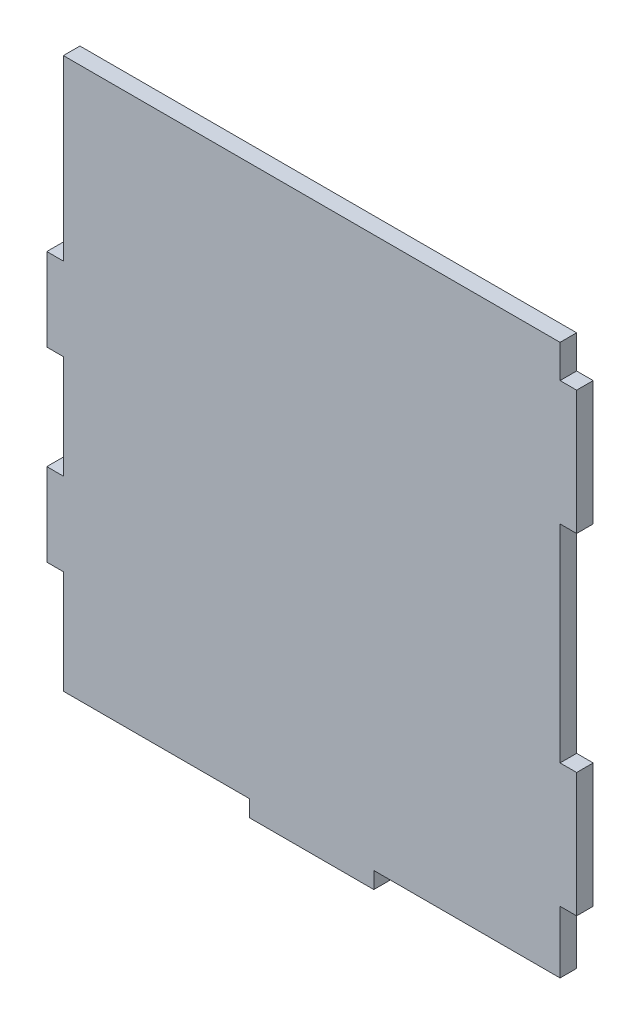
ISO-10303-21;
HEADER;
FILE_DESCRIPTION(('STEP AP214'),'2;1');
FILE_NAME('part.step','',(''),(''),'','','');
FILE_SCHEMA(('AUTOMOTIVE_DESIGN { 1 0 10303 214 1 1 1 1 }'));
ENDSEC;
DATA;
#1=APPLICATION_CONTEXT('core data for automotive mechanical design processes');
#2=APPLICATION_PROTOCOL_DEFINITION('international standard','automotive_design',2000,#1);
#3=PRODUCT_CONTEXT('',#1,'mechanical');
#4=PRODUCT('Part','Part','',(#3));
#5=PRODUCT_RELATED_PRODUCT_CATEGORY('part','',(#4));
#6=PRODUCT_DEFINITION_FORMATION('','',#4);
#7=PRODUCT_DEFINITION_CONTEXT('part definition',#1,'design');
#8=PRODUCT_DEFINITION('design','',#6,#7);
#9=PRODUCT_DEFINITION_SHAPE('','',#8);
#10=(LENGTH_UNIT() NAMED_UNIT(*) SI_UNIT(.MILLI.,.METRE.));
#11=(NAMED_UNIT(*) PLANE_ANGLE_UNIT() SI_UNIT($,.RADIAN.));
#12=(NAMED_UNIT(*) SI_UNIT($,.STERADIAN.) SOLID_ANGLE_UNIT());
#13=UNCERTAINTY_MEASURE_WITH_UNIT(LENGTH_MEASURE(1.E-05),#10,'distance_accuracy_value','');
#14=(GEOMETRIC_REPRESENTATION_CONTEXT(3) GLOBAL_UNCERTAINTY_ASSIGNED_CONTEXT((#13)) GLOBAL_UNIT_ASSIGNED_CONTEXT((#10,
#11,#12)) REPRESENTATION_CONTEXT('',''));
#15=CARTESIAN_POINT('',(0.,0.,0.));
#16=DIRECTION('',(0.,0.,1.));
#17=DIRECTION('',(1.,0.,0.));
#18=AXIS2_PLACEMENT_3D('',#15,#16,#17);
#19=CARTESIAN_POINT('',(0.,0.,4.));
#20=DIRECTION('',(0.,1.,0.));
#21=DIRECTION('',(0.,0.,1.));
#22=AXIS2_PLACEMENT_3D('',#19,#20,#21);
#23=PLANE('',#22);
#24=DIRECTION('',(1.,0.,0.));
#25=VECTOR('',#24,1.);
#26=CARTESIAN_POINT('',(0.,0.,0.));
#27=LINE('',#26,#25);
#28=CARTESIAN_POINT('',(0.,0.,0.));
#29=VERTEX_POINT('',#28);
#30=CARTESIAN_POINT('',(45.,0.,0.));
#31=VERTEX_POINT('',#30);
#32=EDGE_CURVE('E233',#29,#31,#27,.T.);
#33=ORIENTED_EDGE('',*,*,#32,.T.);
#34=DIRECTION('',(0.,0.,-1.));
#35=VECTOR('',#34,1.);
#36=CARTESIAN_POINT('',(45.,0.,4.));
#37=LINE('',#36,#35);
#38=CARTESIAN_POINT('',(45.,0.,4.));
#39=VERTEX_POINT('',#38);
#40=EDGE_CURVE('E11',#39,#31,#37,.T.);
#41=ORIENTED_EDGE('',*,*,#40,.F.);
#42=DIRECTION('',(1.,0.,0.));
#43=VECTOR('',#42,1.);
#44=CARTESIAN_POINT('',(0.,0.,4.));
#45=LINE('',#44,#43);
#46=CARTESIAN_POINT('',(0.,0.,4.));
#47=VERTEX_POINT('',#46);
#48=EDGE_CURVE('E352',#47,#39,#45,.T.);
#49=ORIENTED_EDGE('',*,*,#48,.F.);
#50=DIRECTION('',(0.,0.,-1.));
#51=VECTOR('',#50,1.);
#52=CARTESIAN_POINT('',(0.,0.,4.));
#53=LINE('',#52,#51);
#54=EDGE_CURVE('E54',#47,#29,#53,.T.);
#55=ORIENTED_EDGE('',*,*,#54,.T.);
#56=EDGE_LOOP('',(#33,#41,#49,#55));
#57=FACE_BOUND('',#56,.T.);
#58=ADVANCED_FACE('F37',(#57),#23,.F.);
#59=CARTESIAN_POINT('',(45.,0.,4.));
#60=DIRECTION('',(1.,0.,0.));
#61=DIRECTION('',(0.,0.,-1.));
#62=AXIS2_PLACEMENT_3D('',#59,#60,#61);
#63=PLANE('',#62);
#64=DIRECTION('',(0.,-1.,0.));
#65=VECTOR('',#64,1.);
#66=CARTESIAN_POINT('',(45.,0.,0.));
#67=LINE('',#66,#65);
#68=CARTESIAN_POINT('',(45.,-4.,0.));
#69=VERTEX_POINT('',#68);
#70=EDGE_CURVE('E235',#31,#69,#67,.T.);
#71=ORIENTED_EDGE('',*,*,#70,.T.);
#72=DIRECTION('',(0.,0.,-1.));
#73=VECTOR('',#72,1.);
#74=CARTESIAN_POINT('',(45.,-4.,4.));
#75=LINE('',#74,#73);
#76=CARTESIAN_POINT('',(45.,-4.,4.));
#77=VERTEX_POINT('',#76);
#78=EDGE_CURVE('E46',#77,#69,#75,.T.);
#79=ORIENTED_EDGE('',*,*,#78,.F.);
#80=DIRECTION('',(0.,-1.,0.));
#81=VECTOR('',#80,1.);
#82=CARTESIAN_POINT('',(45.,0.,4.));
#83=LINE('',#82,#81);
#84=EDGE_CURVE('E140',#39,#77,#83,.T.);
#85=ORIENTED_EDGE('',*,*,#84,.F.);
#86=ORIENTED_EDGE('',*,*,#40,.T.);
#87=EDGE_LOOP('',(#71,#79,#85,#86));
#88=FACE_BOUND('',#87,.T.);
#89=ADVANCED_FACE('F39',(#88),#63,.F.);
#90=CARTESIAN_POINT('',(0.,-4.00000000000001,4.));
#91=DIRECTION('',(0.,1.,0.));
#92=DIRECTION('',(-1.,0.,0.));
#93=AXIS2_PLACEMENT_3D('',#90,#91,#92);
#94=PLANE('',#93);
#95=DIRECTION('',(1.,0.,0.));
#96=VECTOR('',#95,1.);
#97=CARTESIAN_POINT('',(0.,-4.00000000000001,0.));
#98=LINE('',#97,#96);
#99=CARTESIAN_POINT('',(75.,-4.,0.));
#100=VERTEX_POINT('',#99);
#101=EDGE_CURVE('E238',#69,#100,#98,.T.);
#102=ORIENTED_EDGE('',*,*,#101,.T.);
#103=DIRECTION('',(0.,0.,-1.));
#104=VECTOR('',#103,1.);
#105=CARTESIAN_POINT('',(75.,-4.,4.));
#106=LINE('',#105,#104);
#107=CARTESIAN_POINT('',(75.,-4.,4.));
#108=VERTEX_POINT('',#107);
#109=EDGE_CURVE('E329',#108,#100,#106,.T.);
#110=ORIENTED_EDGE('',*,*,#109,.F.);
#111=DIRECTION('',(1.,0.,0.));
#112=VECTOR('',#111,1.);
#113=CARTESIAN_POINT('',(0.,-4.00000000000001,4.));
#114=LINE('',#113,#112);
#115=EDGE_CURVE('E336',#77,#108,#114,.T.);
#116=ORIENTED_EDGE('',*,*,#115,.F.);
#117=ORIENTED_EDGE('',*,*,#78,.T.);
#118=EDGE_LOOP('',(#102,#110,#116,#117));
#119=FACE_BOUND('',#118,.T.);
#120=ADVANCED_FACE('F334',(#119),#94,.F.);
#121=CARTESIAN_POINT('',(75.,0.,4.));
#122=DIRECTION('',(1.,0.,0.));
#123=DIRECTION('',(0.,0.,-1.));
#124=AXIS2_PLACEMENT_3D('',#121,#122,#123);
#125=PLANE('',#124);
#126=DIRECTION('',(0.,-1.,0.));
#127=VECTOR('',#126,1.);
#128=CARTESIAN_POINT('',(75.,0.,0.));
#129=LINE('',#128,#127);
#130=CARTESIAN_POINT('',(75.,0.,0.));
#131=VERTEX_POINT('',#130);
#132=EDGE_CURVE('E241',#131,#100,#129,.T.);
#133=ORIENTED_EDGE('',*,*,#132,.F.);
#134=DIRECTION('',(0.,0.,-1.));
#135=VECTOR('',#134,1.);
#136=CARTESIAN_POINT('',(75.,0.,4.));
#137=LINE('',#136,#135);
#138=CARTESIAN_POINT('',(75.,0.,4.));
#139=VERTEX_POINT('',#138);
#140=EDGE_CURVE('E327',#139,#131,#137,.T.);
#141=ORIENTED_EDGE('',*,*,#140,.F.);
#142=DIRECTION('',(0.,-1.,0.));
#143=VECTOR('',#142,1.);
#144=CARTESIAN_POINT('',(75.,0.,4.));
#145=LINE('',#144,#143);
#146=EDGE_CURVE('E347',#139,#108,#145,.T.);
#147=ORIENTED_EDGE('',*,*,#146,.T.);
#148=ORIENTED_EDGE('',*,*,#109,.T.);
#149=EDGE_LOOP('',(#133,#141,#147,#148));
#150=FACE_BOUND('',#149,.T.);
#151=ADVANCED_FACE('F343',(#150),#125,.T.);
#152=CARTESIAN_POINT('',(120.,0.,0.));
#153=VERTEX_POINT('',#152);
#154=EDGE_CURVE('E236',#131,#153,#27,.T.);
#155=ORIENTED_EDGE('',*,*,#154,.T.);
#156=DIRECTION('',(0.,0.,-1.));
#157=VECTOR('',#156,1.);
#158=CARTESIAN_POINT('',(120.,0.,4.));
#159=LINE('',#158,#157);
#160=CARTESIAN_POINT('',(120.,0.,4.));
#161=VERTEX_POINT('',#160);
#162=EDGE_CURVE('E324',#161,#153,#159,.T.);
#163=ORIENTED_EDGE('',*,*,#162,.F.);
#164=EDGE_CURVE('E348',#139,#161,#45,.T.);
#165=ORIENTED_EDGE('',*,*,#164,.F.);
#166=ORIENTED_EDGE('',*,*,#140,.T.);
#167=EDGE_LOOP('',(#155,#163,#165,#166));
#168=FACE_BOUND('',#167,.T.);
#169=ADVANCED_FACE('F406',(#168),#23,.F.);
#170=CARTESIAN_POINT('',(120.,0.,4.));
#171=DIRECTION('',(-1.,0.,0.));
#172=DIRECTION('',(0.,0.,1.));
#173=AXIS2_PLACEMENT_3D('',#170,#171,#172);
#174=PLANE('',#173);
#175=DIRECTION('',(0.,1.,0.));
#176=VECTOR('',#175,1.);
#177=CARTESIAN_POINT('',(120.,0.,0.));
#178=LINE('',#177,#176);
#179=CARTESIAN_POINT('',(120.,15.,0.));
#180=VERTEX_POINT('',#179);
#181=EDGE_CURVE('E244',#153,#180,#178,.T.);
#182=ORIENTED_EDGE('',*,*,#181,.T.);
#183=DIRECTION('',(0.,0.,-1.));
#184=VECTOR('',#183,1.);
#185=CARTESIAN_POINT('',(120.,15.,4.));
#186=LINE('',#185,#184);
#187=CARTESIAN_POINT('',(120.,15.,4.));
#188=VERTEX_POINT('',#187);
#189=EDGE_CURVE('E321',#188,#180,#186,.T.);
#190=ORIENTED_EDGE('',*,*,#189,.F.);
#191=DIRECTION('',(0.,1.,0.));
#192=VECTOR('',#191,1.);
#193=CARTESIAN_POINT('',(120.,0.,4.));
#194=LINE('',#193,#192);
#195=EDGE_CURVE('E350',#161,#188,#194,.T.);
#196=ORIENTED_EDGE('',*,*,#195,.F.);
#197=ORIENTED_EDGE('',*,*,#162,.T.);
#198=EDGE_LOOP('',(#182,#190,#196,#197));
#199=FACE_BOUND('',#198,.T.);
#200=ADVANCED_FACE('F412',(#199),#174,.F.);
#201=CARTESIAN_POINT('',(0.,15.0000000000004,4.));
#202=DIRECTION('',(0.,1.,0.));
#203=DIRECTION('',(-1.,0.,0.));
#204=AXIS2_PLACEMENT_3D('',#201,#202,#203);
#205=PLANE('',#204);
#206=DIRECTION('',(1.,0.,0.));
#207=VECTOR('',#206,1.);
#208=CARTESIAN_POINT('',(0.,15.0000000000004,0.));
#209=LINE('',#208,#207);
#210=CARTESIAN_POINT('',(124.,15.,0.));
#211=VERTEX_POINT('',#210);
#212=EDGE_CURVE('E246',#180,#211,#209,.T.);
#213=ORIENTED_EDGE('',*,*,#212,.T.);
#214=DIRECTION('',(0.,0.,-1.));
#215=VECTOR('',#214,1.);
#216=CARTESIAN_POINT('',(124.,15.,4.));
#217=LINE('',#216,#215);
#218=CARTESIAN_POINT('',(124.,15.,4.));
#219=VERTEX_POINT('',#218);
#220=EDGE_CURVE('E319',#219,#211,#217,.T.);
#221=ORIENTED_EDGE('',*,*,#220,.F.);
#222=DIRECTION('',(1.,0.,0.));
#223=VECTOR('',#222,1.);
#224=CARTESIAN_POINT('',(0.,15.0000000000004,4.));
#225=LINE('',#224,#223);
#226=EDGE_CURVE('E357',#188,#219,#225,.T.);
#227=ORIENTED_EDGE('',*,*,#226,.F.);
#228=ORIENTED_EDGE('',*,*,#189,.T.);
#229=EDGE_LOOP('',(#213,#221,#227,#228));
#230=FACE_BOUND('',#229,.T.);
#231=ADVANCED_FACE('F418',(#230),#205,.F.);
#232=CARTESIAN_POINT('',(124.,0.,4.));
#233=DIRECTION('',(1.,0.,0.));
#234=DIRECTION('',(0.,1.,0.));
#235=AXIS2_PLACEMENT_3D('',#232,#233,#234);
#236=PLANE('',#235);
#237=DIRECTION('',(0.,-1.,0.));
#238=VECTOR('',#237,1.);
#239=CARTESIAN_POINT('',(124.,0.,0.));
#240=LINE('',#239,#238);
#241=CARTESIAN_POINT('',(124.,45.,0.));
#242=VERTEX_POINT('',#241);
#243=EDGE_CURVE('E251',#242,#211,#240,.T.);
#244=ORIENTED_EDGE('',*,*,#243,.F.);
#245=DIRECTION('',(0.,0.,-1.));
#246=VECTOR('',#245,1.);
#247=CARTESIAN_POINT('',(124.,45.,4.));
#248=LINE('',#247,#246);
#249=CARTESIAN_POINT('',(124.,45.,4.));
#250=VERTEX_POINT('',#249);
#251=EDGE_CURVE('E317',#250,#242,#248,.T.);
#252=ORIENTED_EDGE('',*,*,#251,.F.);
#253=DIRECTION('',(0.,-1.,0.));
#254=VECTOR('',#253,1.);
#255=CARTESIAN_POINT('',(124.,0.,4.));
#256=LINE('',#255,#254);
#257=EDGE_CURVE('E361',#250,#219,#256,.T.);
#258=ORIENTED_EDGE('',*,*,#257,.T.);
#259=ORIENTED_EDGE('',*,*,#220,.T.);
#260=EDGE_LOOP('',(#244,#252,#258,#259));
#261=FACE_BOUND('',#260,.T.);
#262=ADVANCED_FACE('F485',(#261),#236,.T.);
#263=CARTESIAN_POINT('',(0.,45.,4.));
#264=DIRECTION('',(0.,1.,0.));
#265=DIRECTION('',(0.,0.,1.));
#266=AXIS2_PLACEMENT_3D('',#263,#264,#265);
#267=PLANE('',#266);
#268=DIRECTION('',(1.,0.,0.));
#269=VECTOR('',#268,1.);
#270=CARTESIAN_POINT('',(0.,45.,0.));
#271=LINE('',#270,#269);
#272=CARTESIAN_POINT('',(120.,45.,0.));
#273=VERTEX_POINT('',#272);
#274=EDGE_CURVE('E254',#273,#242,#271,.T.);
#275=ORIENTED_EDGE('',*,*,#274,.F.);
#276=DIRECTION('',(0.,0.,-1.));
#277=VECTOR('',#276,1.);
#278=CARTESIAN_POINT('',(120.,45.,4.));
#279=LINE('',#278,#277);
#280=CARTESIAN_POINT('',(120.,45.,4.));
#281=VERTEX_POINT('',#280);
#282=EDGE_CURVE('E315',#281,#273,#279,.T.);
#283=ORIENTED_EDGE('',*,*,#282,.F.);
#284=DIRECTION('',(1.,0.,0.));
#285=VECTOR('',#284,1.);
#286=CARTESIAN_POINT('',(0.,45.,4.));
#287=LINE('',#286,#285);
#288=EDGE_CURVE('E364',#281,#250,#287,.T.);
#289=ORIENTED_EDGE('',*,*,#288,.T.);
#290=ORIENTED_EDGE('',*,*,#251,.T.);
#291=EDGE_LOOP('',(#275,#283,#289,#290));
#292=FACE_BOUND('',#291,.T.);
#293=ADVANCED_FACE('F436',(#292),#267,.T.);
#294=CARTESIAN_POINT('',(120.,95.,0.));
#295=VERTEX_POINT('',#294);
#296=EDGE_CURVE('E248',#273,#295,#178,.T.);
#297=ORIENTED_EDGE('',*,*,#296,.T.);
#298=DIRECTION('',(0.,0.,-1.));
#299=VECTOR('',#298,1.);
#300=CARTESIAN_POINT('',(120.,95.,4.));
#301=LINE('',#300,#299);
#302=CARTESIAN_POINT('',(120.,95.,4.));
#303=VERTEX_POINT('',#302);
#304=EDGE_CURVE('E312',#303,#295,#301,.T.);
#305=ORIENTED_EDGE('',*,*,#304,.F.);
#306=EDGE_CURVE('E359',#281,#303,#194,.T.);
#307=ORIENTED_EDGE('',*,*,#306,.F.);
#308=ORIENTED_EDGE('',*,*,#282,.T.);
#309=EDGE_LOOP('',(#297,#305,#307,#308));
#310=FACE_BOUND('',#309,.T.);
#311=ADVANCED_FACE('F421',(#310),#174,.F.);
#312=CARTESIAN_POINT('',(0.,95.,4.));
#313=DIRECTION('',(0.,1.,0.));
#314=DIRECTION('',(0.,0.,1.));
#315=AXIS2_PLACEMENT_3D('',#312,#313,#314);
#316=PLANE('',#315);
#317=DIRECTION('',(1.,0.,0.));
#318=VECTOR('',#317,1.);
#319=CARTESIAN_POINT('',(0.,95.,0.));
#320=LINE('',#319,#318);
#321=CARTESIAN_POINT('',(124.,95.,0.));
#322=VERTEX_POINT('',#321);
#323=EDGE_CURVE('E257',#295,#322,#320,.T.);
#324=ORIENTED_EDGE('',*,*,#323,.T.);
#325=DIRECTION('',(0.,0.,-1.));
#326=VECTOR('',#325,1.);
#327=CARTESIAN_POINT('',(124.,95.,4.));
#328=LINE('',#327,#326);
#329=CARTESIAN_POINT('',(124.,95.,4.));
#330=VERTEX_POINT('',#329);
#331=EDGE_CURVE('E310',#330,#322,#328,.T.);
#332=ORIENTED_EDGE('',*,*,#331,.F.);
#333=DIRECTION('',(1.,0.,0.));
#334=VECTOR('',#333,1.);
#335=CARTESIAN_POINT('',(0.,95.,4.));
#336=LINE('',#335,#334);
#337=EDGE_CURVE('E367',#303,#330,#336,.T.);
#338=ORIENTED_EDGE('',*,*,#337,.F.);
#339=ORIENTED_EDGE('',*,*,#304,.T.);
#340=EDGE_LOOP('',(#324,#332,#338,#339));
#341=FACE_BOUND('',#340,.T.);
#342=ADVANCED_FACE('F473',(#341),#316,.F.);
#343=CARTESIAN_POINT('',(124.,0.,4.));
#344=DIRECTION('',(1.,0.,0.));
#345=DIRECTION('',(0.,0.,-1.));
#346=AXIS2_PLACEMENT_3D('',#343,#344,#345);
#347=PLANE('',#346);
#348=DIRECTION('',(0.,-1.,0.));
#349=VECTOR('',#348,1.);
#350=CARTESIAN_POINT('',(124.,0.,0.));
#351=LINE('',#350,#349);
#352=CARTESIAN_POINT('',(124.,125.,0.));
#353=VERTEX_POINT('',#352);
#354=EDGE_CURVE('E260',#353,#322,#351,.T.);
#355=ORIENTED_EDGE('',*,*,#354,.F.);
#356=DIRECTION('',(0.,0.,-1.));
#357=VECTOR('',#356,1.);
#358=CARTESIAN_POINT('',(124.,125.,4.));
#359=LINE('',#358,#357);
#360=CARTESIAN_POINT('',(124.,125.,4.));
#361=VERTEX_POINT('',#360);
#362=EDGE_CURVE('E308',#361,#353,#359,.T.);
#363=ORIENTED_EDGE('',*,*,#362,.F.);
#364=DIRECTION('',(0.,-1.,0.));
#365=VECTOR('',#364,1.);
#366=CARTESIAN_POINT('',(124.,0.,4.));
#367=LINE('',#366,#365);
#368=EDGE_CURVE('E369',#361,#330,#367,.T.);
#369=ORIENTED_EDGE('',*,*,#368,.T.);
#370=ORIENTED_EDGE('',*,*,#331,.T.);
#371=EDGE_LOOP('',(#355,#363,#369,#370));
#372=FACE_BOUND('',#371,.T.);
#373=ADVANCED_FACE('F469',(#372),#347,.T.);
#374=CARTESIAN_POINT('',(0.,125.,4.));
#375=DIRECTION('',(0.,1.,0.));
#376=DIRECTION('',(0.,0.,1.));
#377=AXIS2_PLACEMENT_3D('',#374,#375,#376);
#378=PLANE('',#377);
#379=DIRECTION('',(1.,0.,0.));
#380=VECTOR('',#379,1.);
#381=CARTESIAN_POINT('',(0.,125.,0.));
#382=LINE('',#381,#380);
#383=CARTESIAN_POINT('',(120.,125.,0.));
#384=VERTEX_POINT('',#383);
#385=EDGE_CURVE('E263',#384,#353,#382,.T.);
#386=ORIENTED_EDGE('',*,*,#385,.F.);
#387=DIRECTION('',(0.,0.,-1.));
#388=VECTOR('',#387,1.);
#389=CARTESIAN_POINT('',(120.,125.,4.));
#390=LINE('',#389,#388);
#391=CARTESIAN_POINT('',(120.,125.,4.));
#392=VERTEX_POINT('',#391);
#393=EDGE_CURVE('E306',#392,#384,#390,.T.);
#394=ORIENTED_EDGE('',*,*,#393,.F.);
#395=DIRECTION('',(1.,0.,0.));
#396=VECTOR('',#395,1.);
#397=CARTESIAN_POINT('',(0.,125.,4.));
#398=LINE('',#397,#396);
#399=EDGE_CURVE('E372',#392,#361,#398,.T.);
#400=ORIENTED_EDGE('',*,*,#399,.T.);
#401=ORIENTED_EDGE('',*,*,#362,.T.);
#402=EDGE_LOOP('',(#386,#394,#400,#401));
#403=FACE_BOUND('',#402,.T.);
#404=ADVANCED_FACE('F466',(#403),#378,.T.);
#405=CARTESIAN_POINT('',(120.,133.,0.));
#406=VERTEX_POINT('',#405);
#407=EDGE_CURVE('E247',#384,#406,#178,.T.);
#408=ORIENTED_EDGE('',*,*,#407,.T.);
#409=DIRECTION('',(0.,0.,-1.));
#410=VECTOR('',#409,1.);
#411=CARTESIAN_POINT('',(120.,133.,4.));
#412=LINE('',#411,#410);
#413=CARTESIAN_POINT('',(120.,133.,4.));
#414=VERTEX_POINT('',#413);
#415=EDGE_CURVE('E304',#414,#406,#412,.T.);
#416=ORIENTED_EDGE('',*,*,#415,.F.);
#417=EDGE_CURVE('E358',#392,#414,#194,.T.);
#418=ORIENTED_EDGE('',*,*,#417,.F.);
#419=ORIENTED_EDGE('',*,*,#393,.T.);
#420=EDGE_LOOP('',(#408,#416,#418,#419));
#421=FACE_BOUND('',#420,.T.);
#422=ADVANCED_FACE('F422',(#421),#174,.F.);
#423=CARTESIAN_POINT('',(0.,133.,4.));
#424=DIRECTION('',(0.,1.,0.));
#425=DIRECTION('',(0.,0.,1.));
#426=AXIS2_PLACEMENT_3D('',#423,#424,#425);
#427=PLANE('',#426);
#428=DIRECTION('',(1.,0.,0.));
#429=VECTOR('',#428,1.);
#430=CARTESIAN_POINT('',(0.,133.,0.));
#431=LINE('',#430,#429);
#432=CARTESIAN_POINT('',(0.,133.,0.));
#433=VERTEX_POINT('',#432);
#434=EDGE_CURVE('E266',#433,#406,#431,.T.);
#435=ORIENTED_EDGE('',*,*,#434,.F.);
#436=DIRECTION('',(0.,0.,-1.));
#437=VECTOR('',#436,1.);
#438=CARTESIAN_POINT('',(0.,133.,4.));
#439=LINE('',#438,#437);
#440=CARTESIAN_POINT('',(0.,133.,4.));
#441=VERTEX_POINT('',#440);
#442=EDGE_CURVE('E302',#441,#433,#439,.T.);
#443=ORIENTED_EDGE('',*,*,#442,.F.);
#444=DIRECTION('',(1.,0.,0.));
#445=VECTOR('',#444,1.);
#446=CARTESIAN_POINT('',(0.,133.,4.));
#447=LINE('',#446,#445);
#448=EDGE_CURVE('E375',#441,#414,#447,.T.);
#449=ORIENTED_EDGE('',*,*,#448,.T.);
#450=ORIENTED_EDGE('',*,*,#415,.T.);
#451=EDGE_LOOP('',(#435,#443,#449,#450));
#452=FACE_BOUND('',#451,.T.);
#453=ADVANCED_FACE('F453',(#452),#427,.T.);
#454=CARTESIAN_POINT('',(0.,0.,4.));
#455=DIRECTION('',(-1.,0.,0.));
#456=DIRECTION('',(0.,0.,1.));
#457=AXIS2_PLACEMENT_3D('',#454,#455,#456);
#458=PLANE('',#457);
#459=DIRECTION('',(0.,1.,0.));
#460=VECTOR('',#459,1.);
#461=CARTESIAN_POINT('',(0.,0.,0.));
#462=LINE('',#461,#460);
#463=CARTESIAN_POINT('',(0.,90.,0.));
#464=VERTEX_POINT('',#463);
#465=EDGE_CURVE('E269',#464,#433,#462,.T.);
#466=ORIENTED_EDGE('',*,*,#465,.F.);
#467=DIRECTION('',(0.,0.,-1.));
#468=VECTOR('',#467,1.);
#469=CARTESIAN_POINT('',(0.,90.,4.));
#470=LINE('',#469,#468);
#471=CARTESIAN_POINT('',(0.,90.,4.));
#472=VERTEX_POINT('',#471);
#473=EDGE_CURVE('E300',#472,#464,#470,.T.);
#474=ORIENTED_EDGE('',*,*,#473,.F.);
#475=DIRECTION('',(0.,1.,0.));
#476=VECTOR('',#475,1.);
#477=CARTESIAN_POINT('',(0.,0.,4.));
#478=LINE('',#477,#476);
#479=EDGE_CURVE('E230',#472,#441,#478,.T.);
#480=ORIENTED_EDGE('',*,*,#479,.T.);
#481=ORIENTED_EDGE('',*,*,#442,.T.);
#482=EDGE_LOOP('',(#466,#474,#480,#481));
#483=FACE_BOUND('',#482,.T.);
#484=ADVANCED_FACE('F456',(#483),#458,.T.);
#485=CARTESIAN_POINT('',(6.24500451351651E-13,90.,4.));
#486=DIRECTION('',(0.,-1.,0.));
#487=DIRECTION('',(1.,0.,0.));
#488=AXIS2_PLACEMENT_3D('',#485,#486,#487);
#489=PLANE('',#488);
#490=DIRECTION('',(-1.,0.,0.));
#491=VECTOR('',#490,1.);
#492=CARTESIAN_POINT('',(6.24500451351651E-13,90.,0.));
#493=LINE('',#492,#491);
#494=CARTESIAN_POINT('',(-4.,90.,0.));
#495=VERTEX_POINT('',#494);
#496=EDGE_CURVE('E272',#464,#495,#493,.T.);
#497=ORIENTED_EDGE('',*,*,#496,.T.);
#498=DIRECTION('',(0.,0.,-1.));
#499=VECTOR('',#498,1.);
#500=CARTESIAN_POINT('',(-4.,90.,4.));
#501=LINE('',#500,#499);
#502=CARTESIAN_POINT('',(-4.,90.,4.));
#503=VERTEX_POINT('',#502);
#504=EDGE_CURVE('E297',#503,#495,#501,.T.);
#505=ORIENTED_EDGE('',*,*,#504,.F.);
#506=DIRECTION('',(-1.,0.,0.));
#507=VECTOR('',#506,1.);
#508=CARTESIAN_POINT('',(6.24500451351651E-13,90.,4.));
#509=LINE('',#508,#507);
#510=EDGE_CURVE('E379',#472,#503,#509,.T.);
#511=ORIENTED_EDGE('',*,*,#510,.F.);
#512=ORIENTED_EDGE('',*,*,#473,.T.);
#513=EDGE_LOOP('',(#497,#505,#511,#512));
#514=FACE_BOUND('',#513,.T.);
#515=ADVANCED_FACE('F460',(#514),#489,.F.);
#516=CARTESIAN_POINT('',(-4.,0.,4.));
#517=DIRECTION('',(1.,0.,0.));
#518=DIRECTION('',(0.,0.,-1.));
#519=AXIS2_PLACEMENT_3D('',#516,#517,#518);
#520=PLANE('',#519);
#521=DIRECTION('',(0.,-1.,0.));
#522=VECTOR('',#521,1.);
#523=CARTESIAN_POINT('',(-4.,0.,0.));
#524=LINE('',#523,#522);
#525=CARTESIAN_POINT('',(-4.,70.,0.));
#526=VERTEX_POINT('',#525);
#527=EDGE_CURVE('E276',#495,#526,#524,.T.);
#528=ORIENTED_EDGE('',*,*,#527,.T.);
#529=DIRECTION('',(0.,0.,-1.));
#530=VECTOR('',#529,1.);
#531=CARTESIAN_POINT('',(-4.,70.,4.));
#532=LINE('',#531,#530);
#533=CARTESIAN_POINT('',(-4.,70.,4.));
#534=VERTEX_POINT('',#533);
#535=EDGE_CURVE('E295',#534,#526,#532,.T.);
#536=ORIENTED_EDGE('',*,*,#535,.F.);
#537=DIRECTION('',(0.,-1.,0.));
#538=VECTOR('',#537,1.);
#539=CARTESIAN_POINT('',(-4.,0.,4.));
#540=LINE('',#539,#538);
#541=EDGE_CURVE('E381',#503,#534,#540,.T.);
#542=ORIENTED_EDGE('',*,*,#541,.F.);
#543=ORIENTED_EDGE('',*,*,#504,.T.);
#544=EDGE_LOOP('',(#528,#536,#542,#543));
#545=FACE_BOUND('',#544,.T.);
#546=ADVANCED_FACE('F463',(#545),#520,.F.);
#547=CARTESIAN_POINT('',(0.,70.,4.));
#548=DIRECTION('',(0.,-1.,0.));
#549=DIRECTION('',(0.,0.,-1.));
#550=AXIS2_PLACEMENT_3D('',#547,#548,#549);
#551=PLANE('',#550);
#552=DIRECTION('',(-1.,0.,0.));
#553=VECTOR('',#552,1.);
#554=CARTESIAN_POINT('',(0.,70.,0.));
#555=LINE('',#554,#553);
#556=CARTESIAN_POINT('',(0.,70.,0.));
#557=VERTEX_POINT('',#556);
#558=EDGE_CURVE('E279',#557,#526,#555,.T.);
#559=ORIENTED_EDGE('',*,*,#558,.F.);
#560=DIRECTION('',(0.,0.,-1.));
#561=VECTOR('',#560,1.);
#562=CARTESIAN_POINT('',(0.,70.,4.));
#563=LINE('',#562,#561);
#564=CARTESIAN_POINT('',(0.,70.,4.));
#565=VERTEX_POINT('',#564);
#566=EDGE_CURVE('E293',#565,#557,#563,.T.);
#567=ORIENTED_EDGE('',*,*,#566,.F.);
#568=DIRECTION('',(-1.,0.,0.));
#569=VECTOR('',#568,1.);
#570=CARTESIAN_POINT('',(0.,70.,4.));
#571=LINE('',#570,#569);
#572=EDGE_CURVE('E383',#565,#534,#571,.T.);
#573=ORIENTED_EDGE('',*,*,#572,.T.);
#574=ORIENTED_EDGE('',*,*,#535,.T.);
#575=EDGE_LOOP('',(#559,#567,#573,#574));
#576=FACE_BOUND('',#575,.T.);
#577=ADVANCED_FACE('F394',(#576),#551,.T.);
#578=CARTESIAN_POINT('',(0.,45.,0.));
#579=VERTEX_POINT('',#578);
#580=EDGE_CURVE('E274',#579,#557,#462,.T.);
#581=ORIENTED_EDGE('',*,*,#580,.F.);
#582=DIRECTION('',(0.,0.,-1.));
#583=VECTOR('',#582,1.);
#584=CARTESIAN_POINT('',(0.,45.,4.));
#585=LINE('',#584,#583);
#586=CARTESIAN_POINT('',(0.,45.,4.));
#587=VERTEX_POINT('',#586);
#588=EDGE_CURVE('E291',#587,#579,#585,.T.);
#589=ORIENTED_EDGE('',*,*,#588,.F.);
#590=EDGE_CURVE('E229',#587,#565,#478,.T.);
#591=ORIENTED_EDGE('',*,*,#590,.T.);
#592=ORIENTED_EDGE('',*,*,#566,.T.);
#593=EDGE_LOOP('',(#581,#589,#591,#592));
#594=FACE_BOUND('',#593,.T.);
#595=ADVANCED_FACE('F388',(#594),#458,.T.);
#596=CARTESIAN_POINT('',(0.,45.,4.));
#597=DIRECTION('',(0.,-1.,0.));
#598=DIRECTION('',(1.,0.,0.));
#599=AXIS2_PLACEMENT_3D('',#596,#597,#598);
#600=PLANE('',#599);
#601=DIRECTION('',(-1.,0.,0.));
#602=VECTOR('',#601,1.);
#603=CARTESIAN_POINT('',(0.,45.,0.));
#604=LINE('',#603,#602);
#605=CARTESIAN_POINT('',(-4.,45.,0.));
#606=VERTEX_POINT('',#605);
#607=EDGE_CURVE('E282',#579,#606,#604,.T.);
#608=ORIENTED_EDGE('',*,*,#607,.T.);
#609=DIRECTION('',(0.,0.,-1.));
#610=VECTOR('',#609,1.);
#611=CARTESIAN_POINT('',(-4.,45.,4.));
#612=LINE('',#611,#610);
#613=CARTESIAN_POINT('',(-4.,45.,4.));
#614=VERTEX_POINT('',#613);
#615=EDGE_CURVE('E213',#614,#606,#612,.T.);
#616=ORIENTED_EDGE('',*,*,#615,.F.);
#617=DIRECTION('',(-1.,0.,0.));
#618=VECTOR('',#617,1.);
#619=CARTESIAN_POINT('',(0.,45.,4.));
#620=LINE('',#619,#618);
#621=EDGE_CURVE('E222',#587,#614,#620,.T.);
#622=ORIENTED_EDGE('',*,*,#621,.F.);
#623=ORIENTED_EDGE('',*,*,#588,.T.);
#624=EDGE_LOOP('',(#608,#616,#622,#623));
#625=FACE_BOUND('',#624,.T.);
#626=ADVANCED_FACE('F584',(#625),#600,.F.);
#627=CARTESIAN_POINT('',(-4.,0.,4.));
#628=DIRECTION('',(-1.,0.,0.));
#629=DIRECTION('',(0.,0.,1.));
#630=AXIS2_PLACEMENT_3D('',#627,#628,#629);
#631=PLANE('',#630);
#632=DIRECTION('',(0.,1.,0.));
#633=VECTOR('',#632,1.);
#634=CARTESIAN_POINT('',(-4.,0.,0.));
#635=LINE('',#634,#633);
#636=CARTESIAN_POINT('',(-4.,25.,0.));
#637=VERTEX_POINT('',#636);
#638=EDGE_CURVE('E209',#637,#606,#635,.T.);
#639=ORIENTED_EDGE('',*,*,#638,.F.);
#640=DIRECTION('',(0.,0.,-1.));
#641=VECTOR('',#640,1.);
#642=CARTESIAN_POINT('',(-4.,25.,4.));
#643=LINE('',#642,#641);
#644=CARTESIAN_POINT('',(-4.,25.,4.));
#645=VERTEX_POINT('',#644);
#646=EDGE_CURVE('E204',#645,#637,#643,.T.);
#647=ORIENTED_EDGE('',*,*,#646,.F.);
#648=DIRECTION('',(0.,1.,0.));
#649=VECTOR('',#648,1.);
#650=CARTESIAN_POINT('',(-4.,0.,4.));
#651=LINE('',#650,#649);
#652=EDGE_CURVE('E207',#645,#614,#651,.T.);
#653=ORIENTED_EDGE('',*,*,#652,.T.);
#654=ORIENTED_EDGE('',*,*,#615,.T.);
#655=EDGE_LOOP('',(#639,#647,#653,#654));
#656=FACE_BOUND('',#655,.T.);
#657=ADVANCED_FACE('F206',(#656),#631,.T.);
#658=CARTESIAN_POINT('',(0.,25.,4.));
#659=DIRECTION('',(0.,-1.,0.));
#660=DIRECTION('',(1.,0.,0.));
#661=AXIS2_PLACEMENT_3D('',#658,#659,#660);
#662=PLANE('',#661);
#663=DIRECTION('',(-1.,0.,0.));
#664=VECTOR('',#663,1.);
#665=CARTESIAN_POINT('',(0.,25.,0.));
#666=LINE('',#665,#664);
#667=CARTESIAN_POINT('',(0.,25.,0.));
#668=VERTEX_POINT('',#667);
#669=EDGE_CURVE('E286',#668,#637,#666,.T.);
#670=ORIENTED_EDGE('',*,*,#669,.F.);
#671=DIRECTION('',(0.,0.,-1.));
#672=VECTOR('',#671,1.);
#673=CARTESIAN_POINT('',(0.,25.,4.));
#674=LINE('',#673,#672);
#675=CARTESIAN_POINT('',(0.,25.,4.));
#676=VERTEX_POINT('',#675);
#677=EDGE_CURVE('E128',#676,#668,#674,.T.);
#678=ORIENTED_EDGE('',*,*,#677,.F.);
#679=DIRECTION('',(-1.,0.,0.));
#680=VECTOR('',#679,1.);
#681=CARTESIAN_POINT('',(0.,25.,4.));
#682=LINE('',#681,#680);
#683=EDGE_CURVE('E219',#676,#645,#682,.T.);
#684=ORIENTED_EDGE('',*,*,#683,.T.);
#685=ORIENTED_EDGE('',*,*,#646,.T.);
#686=EDGE_LOOP('',(#670,#678,#684,#685));
#687=FACE_BOUND('',#686,.T.);
#688=ADVANCED_FACE('F225',(#687),#662,.T.);
#689=EDGE_CURVE('E273',#29,#668,#462,.T.);
#690=ORIENTED_EDGE('',*,*,#689,.F.);
#691=ORIENTED_EDGE('',*,*,#54,.F.);
#692=EDGE_CURVE('E226',#47,#676,#478,.T.);
#693=ORIENTED_EDGE('',*,*,#692,.T.);
#694=ORIENTED_EDGE('',*,*,#677,.T.);
#695=EDGE_LOOP('',(#690,#691,#693,#694));
#696=FACE_BOUND('',#695,.T.);
#697=ADVANCED_FACE('F550',(#696),#458,.T.);
#698=CARTESIAN_POINT('',(0.,0.,4.));
#699=DIRECTION('',(0.,0.,1.));
#700=DIRECTION('',(1.,0.,0.));
#701=AXIS2_PLACEMENT_3D('',#698,#699,#700);
#702=PLANE('',#701);
#703=ORIENTED_EDGE('',*,*,#48,.T.);
#704=ORIENTED_EDGE('',*,*,#84,.T.);
#705=ORIENTED_EDGE('',*,*,#115,.T.);
#706=ORIENTED_EDGE('',*,*,#146,.F.);
#707=ORIENTED_EDGE('',*,*,#164,.T.);
#708=ORIENTED_EDGE('',*,*,#195,.T.);
#709=ORIENTED_EDGE('',*,*,#226,.T.);
#710=ORIENTED_EDGE('',*,*,#257,.F.);
#711=ORIENTED_EDGE('',*,*,#288,.F.);
#712=ORIENTED_EDGE('',*,*,#306,.T.);
#713=ORIENTED_EDGE('',*,*,#337,.T.);
#714=ORIENTED_EDGE('',*,*,#368,.F.);
#715=ORIENTED_EDGE('',*,*,#399,.F.);
#716=ORIENTED_EDGE('',*,*,#417,.T.);
#717=ORIENTED_EDGE('',*,*,#448,.F.);
#718=ORIENTED_EDGE('',*,*,#479,.F.);
#719=ORIENTED_EDGE('',*,*,#510,.T.);
#720=ORIENTED_EDGE('',*,*,#541,.T.);
#721=ORIENTED_EDGE('',*,*,#572,.F.);
#722=ORIENTED_EDGE('',*,*,#590,.F.);
#723=ORIENTED_EDGE('',*,*,#621,.T.);
#724=ORIENTED_EDGE('',*,*,#652,.F.);
#725=ORIENTED_EDGE('',*,*,#683,.F.);
#726=ORIENTED_EDGE('',*,*,#692,.F.);
#727=EDGE_LOOP('',(#703,#704,#705,#706,#707,#708,#709,#710,#711,#712,#713,#714,#715,#716,#717,
#718,#719,#720,#721,#722,#723,#724,#725,#726));
#728=FACE_BOUND('',#727,.T.);
#729=ADVANCED_FACE('F217',(#728),#702,.T.);
#730=CARTESIAN_POINT('',(0.,0.,0.));
#731=DIRECTION('',(0.,0.,1.));
#732=DIRECTION('',(1.,0.,0.));
#733=AXIS2_PLACEMENT_3D('',#730,#731,#732);
#734=PLANE('',#733);
#735=ORIENTED_EDGE('',*,*,#32,.F.);
#736=ORIENTED_EDGE('',*,*,#689,.T.);
#737=ORIENTED_EDGE('',*,*,#669,.T.);
#738=ORIENTED_EDGE('',*,*,#638,.T.);
#739=ORIENTED_EDGE('',*,*,#607,.F.);
#740=ORIENTED_EDGE('',*,*,#580,.T.);
#741=ORIENTED_EDGE('',*,*,#558,.T.);
#742=ORIENTED_EDGE('',*,*,#527,.F.);
#743=ORIENTED_EDGE('',*,*,#496,.F.);
#744=ORIENTED_EDGE('',*,*,#465,.T.);
#745=ORIENTED_EDGE('',*,*,#434,.T.);
#746=ORIENTED_EDGE('',*,*,#407,.F.);
#747=ORIENTED_EDGE('',*,*,#385,.T.);
#748=ORIENTED_EDGE('',*,*,#354,.T.);
#749=ORIENTED_EDGE('',*,*,#323,.F.);
#750=ORIENTED_EDGE('',*,*,#296,.F.);
#751=ORIENTED_EDGE('',*,*,#274,.T.);
#752=ORIENTED_EDGE('',*,*,#243,.T.);
#753=ORIENTED_EDGE('',*,*,#212,.F.);
#754=ORIENTED_EDGE('',*,*,#181,.F.);
#755=ORIENTED_EDGE('',*,*,#154,.F.);
#756=ORIENTED_EDGE('',*,*,#132,.T.);
#757=ORIENTED_EDGE('',*,*,#101,.F.);
#758=ORIENTED_EDGE('',*,*,#70,.F.);
#759=EDGE_LOOP('',(#735,#736,#737,#738,#739,#740,#741,#742,#743,#744,#745,#746,#747,#748,#749,
#750,#751,#752,#753,#754,#755,#756,#757,#758));
#760=FACE_BOUND('',#759,.T.);
#761=ADVANCED_FACE('F338',(#760),#734,.F.);
#762=CLOSED_SHELL('',(#58,#89,#120,#151,#169,#200,#231,#262,#293,#311,#342,#373,#404,#422,#453,
#484,#515,#546,#577,#595,#626,#657,#688,#697,#729,#761));
#763=MANIFOLD_SOLID_BREP('B2',#762);
#764=ADVANCED_BREP_SHAPE_REPRESENTATION('',(#18,#763),#14);
#765=SHAPE_DEFINITION_REPRESENTATION(#9,#764);
ENDSEC;
END-ISO-10303-21;
